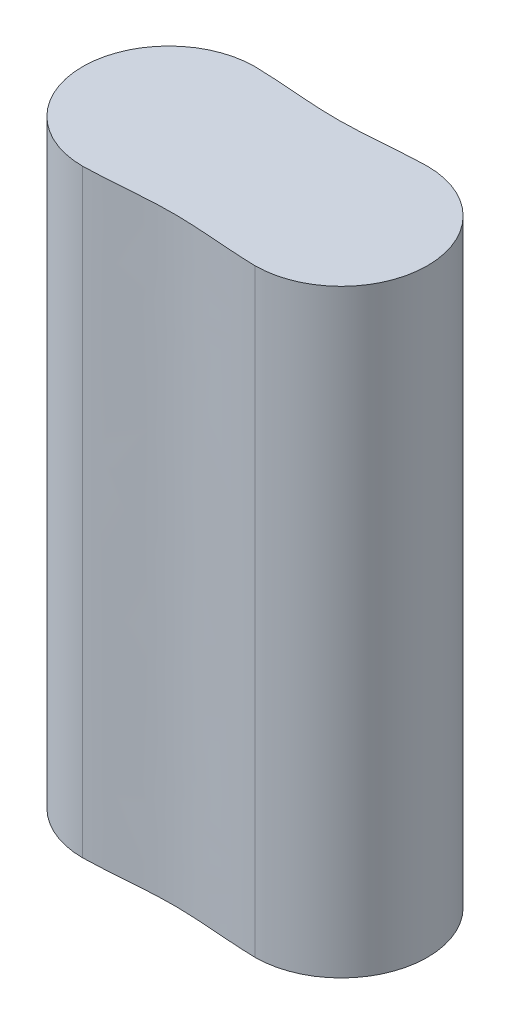
ISO-10303-21;
HEADER;
FILE_DESCRIPTION(('STEP AP214'),'2;1');
FILE_NAME('part.step','',(''),(''),'','','');
FILE_SCHEMA(('AUTOMOTIVE_DESIGN { 1 0 10303 214 1 1 1 1 }'));
ENDSEC;
DATA;
#1=APPLICATION_CONTEXT('core data for automotive mechanical design processes');
#2=APPLICATION_PROTOCOL_DEFINITION('international standard','automotive_design',2000,#1);
#3=PRODUCT_CONTEXT('',#1,'mechanical');
#4=PRODUCT('Part','Part','',(#3));
#5=PRODUCT_RELATED_PRODUCT_CATEGORY('part','',(#4));
#6=PRODUCT_DEFINITION_FORMATION('','',#4);
#7=PRODUCT_DEFINITION_CONTEXT('part definition',#1,'design');
#8=PRODUCT_DEFINITION('design','',#6,#7);
#9=PRODUCT_DEFINITION_SHAPE('','',#8);
#10=(LENGTH_UNIT() NAMED_UNIT(*) SI_UNIT(.MILLI.,.METRE.));
#11=(NAMED_UNIT(*) PLANE_ANGLE_UNIT() SI_UNIT($,.RADIAN.));
#12=(NAMED_UNIT(*) SI_UNIT($,.STERADIAN.) SOLID_ANGLE_UNIT());
#13=UNCERTAINTY_MEASURE_WITH_UNIT(LENGTH_MEASURE(1.E-05),#10,'distance_accuracy_value','');
#14=(GEOMETRIC_REPRESENTATION_CONTEXT(3) GLOBAL_UNCERTAINTY_ASSIGNED_CONTEXT((#13)) GLOBAL_UNIT_ASSIGNED_CONTEXT((#10,
#11,#12)) REPRESENTATION_CONTEXT('',''));
#15=CARTESIAN_POINT('',(0.,0.,0.));
#16=DIRECTION('',(0.,0.,1.));
#17=DIRECTION('',(1.,0.,0.));
#18=AXIS2_PLACEMENT_3D('',#15,#16,#17);
#19=CARTESIAN_POINT('',(0.,66.,9.5));
#20=CARTESIAN_POINT('',(3.09812718390204,66.,9.43812352322438));
#21=CARTESIAN_POINT('',(9.50000000003282,66.,8.56187647677678));
#22=CARTESIAN_POINT('',(15.9018728160891,66.,9.43812352322207));
#23=CARTESIAN_POINT('',(19.,66.,9.5));
#24=B_SPLINE_CURVE_WITH_KNOTS('',3,(#19,#20,#21,#22,#23),.UNSPECIFIED.,.F.,.F.,(4,1,4),
(0.29228937355897,0.5,0.70771062644195),.UNSPECIFIED.);
#25=DIRECTION('',(0.,-1.,0.));
#26=VECTOR('',#25,1.);
#27=SURFACE_OF_LINEAR_EXTRUSION('',#24,#26);
#28=CARTESIAN_POINT('',(0.,0.,9.5));
#29=CARTESIAN_POINT('',(3.09812718390204,0.,9.43812352322438));
#30=CARTESIAN_POINT('',(9.50000000003282,0.,8.56187647677678));
#31=CARTESIAN_POINT('',(15.9018728160891,0.,9.43812352322207));
#32=CARTESIAN_POINT('',(19.,0.,9.5));
#33=B_SPLINE_CURVE_WITH_KNOTS('',3,(#28,#29,#30,#31,#32),.UNSPECIFIED.,.F.,.F.,(4,1,4),
(0.29228937355897,0.5,0.70771062644195),.UNSPECIFIED.);
#34=CARTESIAN_POINT('',(0.,0.,9.5));
#35=VERTEX_POINT('',#34);
#36=CARTESIAN_POINT('',(19.,0.,9.5));
#37=VERTEX_POINT('',#36);
#38=EDGE_CURVE('E134',#35,#37,#33,.T.);
#39=ORIENTED_EDGE('',*,*,#38,.T.);
#40=DIRECTION('',(0.,-1.,0.));
#41=VECTOR('',#40,1.);
#42=CARTESIAN_POINT('',(19.,66.,9.5));
#43=LINE('',#42,#41);
#44=CARTESIAN_POINT('',(19.,66.,9.5));
#45=VERTEX_POINT('',#44);
#46=EDGE_CURVE('E11',#45,#37,#43,.T.);
#47=ORIENTED_EDGE('',*,*,#46,.F.);
#48=CARTESIAN_POINT('',(0.,66.,9.5));
#49=VERTEX_POINT('',#48);
#50=EDGE_CURVE('E96',#49,#45,#24,.T.);
#51=ORIENTED_EDGE('',*,*,#50,.F.);
#52=DIRECTION('',(0.,-1.,0.));
#53=VECTOR('',#52,1.);
#54=CARTESIAN_POINT('',(0.,66.,9.5));
#55=LINE('',#54,#53);
#56=EDGE_CURVE('E111',#49,#35,#55,.T.);
#57=ORIENTED_EDGE('',*,*,#56,.T.);
#58=EDGE_LOOP('',(#39,#47,#51,#57));
#59=FACE_BOUND('',#58,.T.);
#60=ADVANCED_FACE('F47',(#59),#27,.F.);
#61=CARTESIAN_POINT('',(19.,66.,0.));
#62=DIRECTION('',(0.,-1.,0.));
#63=DIRECTION('',(0.,0.,-1.));
#64=AXIS2_PLACEMENT_3D('',#61,#62,#63);
#65=CYLINDRICAL_SURFACE('',#64,9.5);
#66=CARTESIAN_POINT('',(19.,0.,0.));
#67=DIRECTION('',(0.,1.,0.));
#68=DIRECTION('',(0.,0.,1.));
#69=AXIS2_PLACEMENT_3D('',#66,#67,#68);
#70=CIRCLE('',#69,9.5);
#71=CARTESIAN_POINT('',(19.,0.,-9.5));
#72=VERTEX_POINT('',#71);
#73=EDGE_CURVE('E102',#37,#72,#70,.T.);
#74=ORIENTED_EDGE('',*,*,#73,.T.);
#75=DIRECTION('',(0.,-1.,0.));
#76=VECTOR('',#75,1.);
#77=CARTESIAN_POINT('',(19.,66.,-9.5));
#78=LINE('',#77,#76);
#79=CARTESIAN_POINT('',(19.,66.,-9.5));
#80=VERTEX_POINT('',#79);
#81=EDGE_CURVE('E57',#80,#72,#78,.T.);
#82=ORIENTED_EDGE('',*,*,#81,.F.);
#83=CARTESIAN_POINT('',(19.,66.,0.));
#84=DIRECTION('',(0.,1.,0.));
#85=DIRECTION('',(0.,0.,1.));
#86=AXIS2_PLACEMENT_3D('',#83,#84,#85);
#87=CIRCLE('',#86,9.5);
#88=EDGE_CURVE('E91',#45,#80,#87,.T.);
#89=ORIENTED_EDGE('',*,*,#88,.F.);
#90=ORIENTED_EDGE('',*,*,#46,.T.);
#91=EDGE_LOOP('',(#74,#82,#89,#90));
#92=FACE_BOUND('',#91,.T.);
#93=ADVANCED_FACE('F101',(#92),#65,.T.);
#94=CARTESIAN_POINT('',(0.,66.,-9.5));
#95=CARTESIAN_POINT('',(3.09812718390204,66.,-9.43812352322438));
#96=CARTESIAN_POINT('',(9.50000000003282,66.,-8.56187647677678));
#97=CARTESIAN_POINT('',(15.9018728160891,66.,-9.43812352322207));
#98=CARTESIAN_POINT('',(19.,66.,-9.5));
#99=B_SPLINE_CURVE_WITH_KNOTS('',3,(#94,#95,#96,#97,#98),.UNSPECIFIED.,.F.,.F.,(4,1,4),
(0.29228937355897,0.5,0.70771062644195),.UNSPECIFIED.);
#100=DIRECTION('',(0.,-1.,0.));
#101=VECTOR('',#100,1.);
#102=SURFACE_OF_LINEAR_EXTRUSION('',#99,#101);
#103=CARTESIAN_POINT('',(0.,0.,-9.5));
#104=CARTESIAN_POINT('',(3.09812718390204,0.,-9.43812352322438));
#105=CARTESIAN_POINT('',(9.50000000003282,0.,-8.56187647677678));
#106=CARTESIAN_POINT('',(15.9018728160891,0.,-9.43812352322207));
#107=CARTESIAN_POINT('',(19.,0.,-9.5));
#108=B_SPLINE_CURVE_WITH_KNOTS('',3,(#103,#104,#105,#106,#107),.UNSPECIFIED.,.F.,.F.,(4,1,4),
(0.29228937355897,0.5,0.70771062644195),.UNSPECIFIED.);
#109=CARTESIAN_POINT('',(0.,0.,-9.5));
#110=VERTEX_POINT('',#109);
#111=EDGE_CURVE('E138',#110,#72,#108,.T.);
#112=ORIENTED_EDGE('',*,*,#111,.F.);
#113=DIRECTION('',(0.,-1.,0.));
#114=VECTOR('',#113,1.);
#115=CARTESIAN_POINT('',(0.,66.,-9.5));
#116=LINE('',#115,#114);
#117=CARTESIAN_POINT('',(0.,66.,-9.5));
#118=VERTEX_POINT('',#117);
#119=EDGE_CURVE('E81',#118,#110,#116,.T.);
#120=ORIENTED_EDGE('',*,*,#119,.F.);
#121=EDGE_CURVE('E94',#118,#80,#99,.T.);
#122=ORIENTED_EDGE('',*,*,#121,.T.);
#123=ORIENTED_EDGE('',*,*,#81,.T.);
#124=EDGE_LOOP('',(#112,#120,#122,#123));
#125=FACE_BOUND('',#124,.T.);
#126=ADVANCED_FACE('F107',(#125),#102,.T.);
#127=CARTESIAN_POINT('',(0.,66.,0.));
#128=DIRECTION('',(0.,-1.,0.));
#129=DIRECTION('',(0.,0.,-1.));
#130=AXIS2_PLACEMENT_3D('',#127,#128,#129);
#131=CYLINDRICAL_SURFACE('',#130,9.5);
#132=CARTESIAN_POINT('',(0.,0.,0.));
#133=DIRECTION('',(0.,1.,0.));
#134=DIRECTION('',(0.,0.,1.));
#135=AXIS2_PLACEMENT_3D('',#132,#133,#134);
#136=CIRCLE('',#135,9.5);
#137=EDGE_CURVE('E84',#110,#35,#136,.T.);
#138=ORIENTED_EDGE('',*,*,#137,.T.);
#139=ORIENTED_EDGE('',*,*,#56,.F.);
#140=CARTESIAN_POINT('',(0.,66.,0.));
#141=DIRECTION('',(0.,1.,0.));
#142=DIRECTION('',(0.,0.,1.));
#143=AXIS2_PLACEMENT_3D('',#140,#141,#142);
#144=CIRCLE('',#143,9.5);
#145=EDGE_CURVE('E65',#118,#49,#144,.T.);
#146=ORIENTED_EDGE('',*,*,#145,.F.);
#147=ORIENTED_EDGE('',*,*,#119,.T.);
#148=EDGE_LOOP('',(#138,#139,#146,#147));
#149=FACE_BOUND('',#148,.T.);
#150=ADVANCED_FACE('F123',(#149),#131,.T.);
#151=CARTESIAN_POINT('',(0.,66.,0.));
#152=DIRECTION('',(0.,1.,0.));
#153=DIRECTION('',(0.,0.,1.));
#154=AXIS2_PLACEMENT_3D('',#151,#152,#153);
#155=PLANE('',#154);
#156=ORIENTED_EDGE('',*,*,#50,.T.);
#157=ORIENTED_EDGE('',*,*,#88,.T.);
#158=ORIENTED_EDGE('',*,*,#121,.F.);
#159=ORIENTED_EDGE('',*,*,#145,.T.);
#160=EDGE_LOOP('',(#156,#157,#158,#159));
#161=FACE_BOUND('',#160,.T.);
#162=ADVANCED_FACE('F92',(#161),#155,.T.);
#163=CARTESIAN_POINT('',(0.,0.,0.));
#164=DIRECTION('',(0.,1.,0.));
#165=DIRECTION('',(0.,0.,1.));
#166=AXIS2_PLACEMENT_3D('',#163,#164,#165);
#167=PLANE('',#166);
#168=ORIENTED_EDGE('',*,*,#38,.F.);
#169=ORIENTED_EDGE('',*,*,#137,.F.);
#170=ORIENTED_EDGE('',*,*,#111,.T.);
#171=ORIENTED_EDGE('',*,*,#73,.F.);
#172=EDGE_LOOP('',(#168,#169,#170,#171));
#173=FACE_BOUND('',#172,.T.);
#174=ADVANCED_FACE('F165',(#173),#167,.F.);
#175=CLOSED_SHELL('',(#60,#93,#126,#150,#162,#174));
#176=MANIFOLD_SOLID_BREP('B2',#175);
#177=ADVANCED_BREP_SHAPE_REPRESENTATION('',(#18,#176),#14);
#178=SHAPE_DEFINITION_REPRESENTATION(#9,#177);
ENDSEC;
END-ISO-10303-21;
